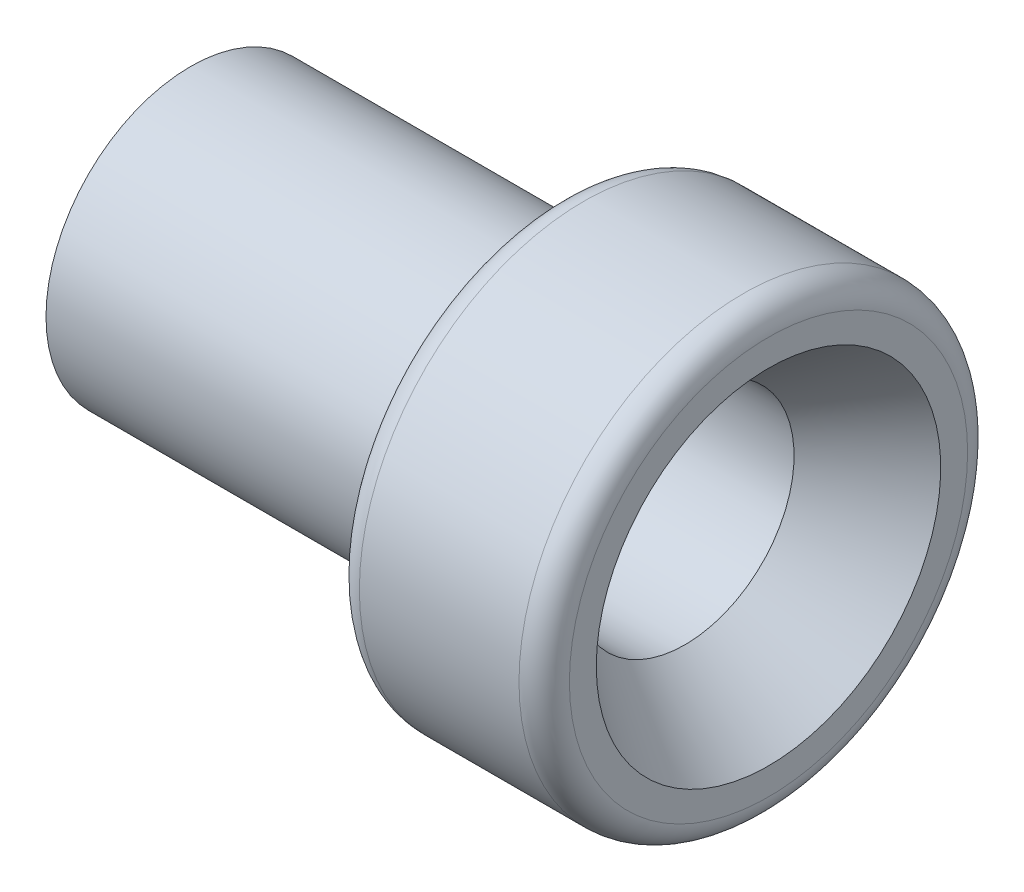
ISO-10303-21;
HEADER;
FILE_DESCRIPTION(('STEP AP214'),'2;1');
FILE_NAME('part.step','',(''),(''),'','','');
FILE_SCHEMA(('AUTOMOTIVE_DESIGN { 1 0 10303 214 1 1 1 1 }'));
ENDSEC;
DATA;
#1=APPLICATION_CONTEXT('core data for automotive mechanical design processes');
#2=APPLICATION_PROTOCOL_DEFINITION('international standard','automotive_design',2000,#1);
#3=PRODUCT_CONTEXT('',#1,'mechanical');
#4=PRODUCT('Part','Part','',(#3));
#5=PRODUCT_RELATED_PRODUCT_CATEGORY('part','',(#4));
#6=PRODUCT_DEFINITION_FORMATION('','',#4);
#7=PRODUCT_DEFINITION_CONTEXT('part definition',#1,'design');
#8=PRODUCT_DEFINITION('design','',#6,#7);
#9=PRODUCT_DEFINITION_SHAPE('','',#8);
#10=(LENGTH_UNIT() NAMED_UNIT(*) SI_UNIT(.MILLI.,.METRE.));
#11=(NAMED_UNIT(*) PLANE_ANGLE_UNIT() SI_UNIT($,.RADIAN.));
#12=(NAMED_UNIT(*) SI_UNIT($,.STERADIAN.) SOLID_ANGLE_UNIT());
#13=UNCERTAINTY_MEASURE_WITH_UNIT(LENGTH_MEASURE(1.E-05),#10,'distance_accuracy_value','');
#14=(GEOMETRIC_REPRESENTATION_CONTEXT(3) GLOBAL_UNCERTAINTY_ASSIGNED_CONTEXT((#13)) GLOBAL_UNIT_ASSIGNED_CONTEXT((#10,
#11,#12)) REPRESENTATION_CONTEXT('',''));
#15=CARTESIAN_POINT('',(0.,0.,0.));
#16=DIRECTION('',(0.,0.,1.));
#17=DIRECTION('',(1.,0.,0.));
#18=AXIS2_PLACEMENT_3D('',#15,#16,#17);
#19=CARTESIAN_POINT('',(-4.3688,1.651,0.));
#20=DIRECTION('',(1.,0.,0.));
#21=DIRECTION('',(0.,0.,-1.));
#22=AXIS2_PLACEMENT_3D('',#19,#20,#21);
#23=PLANE('',#22);
#24=CARTESIAN_POINT('',(-4.3688,0.,0.));
#25=DIRECTION('',(-1.,0.,0.));
#26=DIRECTION('',(0.,0.,1.));
#27=AXIS2_PLACEMENT_3D('',#24,#25,#26);
#28=CIRCLE('',#27,1.651);
#29=CARTESIAN_POINT('',(-4.3688,0.,1.651));
#30=VERTEX_POINT('',#29);
#31=EDGE_CURVE('E10',#30,#30,#28,.T.);
#32=ORIENTED_EDGE('',*,*,#31,.F.);
#33=EDGE_LOOP('',(#32));
#34=FACE_BOUND('',#33,.T.);
#35=CARTESIAN_POINT('',(-4.3688,0.,0.));
#36=DIRECTION('',(-1.,0.,0.));
#37=DIRECTION('',(0.,0.,1.));
#38=AXIS2_PLACEMENT_3D('',#35,#36,#37);
#39=CIRCLE('',#38,2.1844);
#40=CARTESIAN_POINT('',(-4.3688,0.,2.1844));
#41=VERTEX_POINT('',#40);
#42=EDGE_CURVE('E61',#41,#41,#39,.T.);
#43=ORIENTED_EDGE('',*,*,#42,.T.);
#44=EDGE_LOOP('',(#43));
#45=FACE_BOUND('',#44,.T.);
#46=ADVANCED_FACE('F30',(#34,#45),#23,.F.);
#47=CARTESIAN_POINT('',(-4.3688,0.,0.));
#48=DIRECTION('',(-1.,0.,0.));
#49=DIRECTION('',(0.,0.,1.));
#50=AXIS2_PLACEMENT_3D('',#47,#48,#49);
#51=CYLINDRICAL_SURFACE('',#50,1.651);
#52=CARTESIAN_POINT('',(3.10478980740656,0.,0.));
#53=DIRECTION('',(-1.,0.,0.));
#54=DIRECTION('',(0.,0.,1.));
#55=AXIS2_PLACEMENT_3D('',#52,#53,#54);
#56=CIRCLE('',#55,1.651);
#57=CARTESIAN_POINT('',(3.10478980740656,0.,1.651));
#58=VERTEX_POINT('',#57);
#59=EDGE_CURVE('E36',#58,#58,#56,.T.);
#60=ORIENTED_EDGE('',*,*,#59,.F.);
#61=EDGE_LOOP('',(#60));
#62=FACE_BOUND('',#61,.T.);
#63=ORIENTED_EDGE('',*,*,#31,.T.);
#64=EDGE_LOOP('',(#63));
#65=FACE_BOUND('',#64,.T.);
#66=ADVANCED_FACE('F104',(#62,#65),#51,.F.);
#67=CARTESIAN_POINT('',(3.10478980740656,0.,0.));
#68=DIRECTION('',(1.,0.,0.));
#69=DIRECTION('',(0.,0.,-1.));
#70=AXIS2_PLACEMENT_3D('',#67,#68,#69);
#71=CONICAL_SURFACE('',#70,1.651,0.645771823237904);
#72=CARTESIAN_POINT('',(4.3688,0.,0.));
#73=DIRECTION('',(-1.,0.,0.));
#74=DIRECTION('',(0.,0.,1.));
#75=AXIS2_PLACEMENT_3D('',#72,#73,#74);
#76=CIRCLE('',#75,2.6035);
#77=CARTESIAN_POINT('',(4.3688,0.,2.6035));
#78=VERTEX_POINT('',#77);
#79=EDGE_CURVE('E40',#78,#78,#76,.T.);
#80=ORIENTED_EDGE('',*,*,#79,.F.);
#81=EDGE_LOOP('',(#80));
#82=FACE_BOUND('',#81,.T.);
#83=ORIENTED_EDGE('',*,*,#59,.T.);
#84=EDGE_LOOP('',(#83));
#85=FACE_BOUND('',#84,.T.);
#86=ADVANCED_FACE('F99',(#82,#85),#71,.F.);
#87=CARTESIAN_POINT('',(4.3688,2.6035,0.));
#88=DIRECTION('',(-1.,0.,0.));
#89=DIRECTION('',(0.,0.,1.));
#90=AXIS2_PLACEMENT_3D('',#87,#88,#89);
#91=PLANE('',#90);
#92=CARTESIAN_POINT('',(4.3688,0.,0.));
#93=DIRECTION('',(-1.,0.,0.));
#94=DIRECTION('',(0.,0.,1.));
#95=AXIS2_PLACEMENT_3D('',#92,#93,#94);
#96=CIRCLE('',#95,3.0099);
#97=CARTESIAN_POINT('',(4.3688,0.,3.0099));
#98=VERTEX_POINT('',#97);
#99=EDGE_CURVE('E44',#98,#98,#96,.T.);
#100=ORIENTED_EDGE('',*,*,#99,.F.);
#101=EDGE_LOOP('',(#100));
#102=FACE_BOUND('',#101,.T.);
#103=ORIENTED_EDGE('',*,*,#79,.T.);
#104=EDGE_LOOP('',(#103));
#105=FACE_BOUND('',#104,.T.);
#106=ADVANCED_FACE('F93',(#102,#105),#91,.F.);
#107=CARTESIAN_POINT('',(3.9878,0.,0.));
#108=DIRECTION('',(-1.,0.,0.));
#109=DIRECTION('',(0.,0.,1.));
#110=AXIS2_PLACEMENT_3D('',#107,#108,#109);
#111=TOROIDAL_SURFACE('',#110,3.0099,0.381000000000001);
#112=CARTESIAN_POINT('',(3.9878,0.,0.));
#113=DIRECTION('',(-1.,0.,0.));
#114=DIRECTION('',(0.,0.,1.));
#115=AXIS2_PLACEMENT_3D('',#112,#113,#114);
#116=CIRCLE('',#115,3.3909);
#117=CARTESIAN_POINT('',(3.9878,0.,3.3909));
#118=VERTEX_POINT('',#117);
#119=EDGE_CURVE('E49',#118,#118,#116,.T.);
#120=ORIENTED_EDGE('',*,*,#119,.F.);
#121=EDGE_LOOP('',(#120));
#122=FACE_BOUND('',#121,.T.);
#123=ORIENTED_EDGE('',*,*,#99,.T.);
#124=EDGE_LOOP('',(#123));
#125=FACE_BOUND('',#124,.T.);
#126=ADVANCED_FACE('F87',(#122,#125),#111,.T.);
#127=CARTESIAN_POINT('',(-4.3688,0.,0.));
#128=DIRECTION('',(-1.,0.,0.));
#129=DIRECTION('',(0.,0.,1.));
#130=AXIS2_PLACEMENT_3D('',#127,#128,#129);
#131=CYLINDRICAL_SURFACE('',#130,3.3909);
#132=CARTESIAN_POINT('',(1.5748,0.,0.));
#133=DIRECTION('',(-1.,0.,0.));
#134=DIRECTION('',(0.,0.,1.));
#135=AXIS2_PLACEMENT_3D('',#132,#133,#134);
#136=CIRCLE('',#135,3.3909);
#137=CARTESIAN_POINT('',(1.5748,0.,3.3909));
#138=VERTEX_POINT('',#137);
#139=EDGE_CURVE('E52',#138,#138,#136,.T.);
#140=ORIENTED_EDGE('',*,*,#139,.F.);
#141=EDGE_LOOP('',(#140));
#142=FACE_BOUND('',#141,.T.);
#143=ORIENTED_EDGE('',*,*,#119,.T.);
#144=EDGE_LOOP('',(#143));
#145=FACE_BOUND('',#144,.T.);
#146=ADVANCED_FACE('F81',(#142,#145),#131,.T.);
#147=CARTESIAN_POINT('',(1.5748,0.,0.));
#148=DIRECTION('',(-1.,0.,0.));
#149=DIRECTION('',(0.,0.,1.));
#150=AXIS2_PLACEMENT_3D('',#147,#148,#149);
#151=TOROIDAL_SURFACE('',#150,3.0099,0.381);
#152=CARTESIAN_POINT('',(1.1938,0.,0.));
#153=DIRECTION('',(-1.,0.,0.));
#154=DIRECTION('',(0.,0.,1.));
#155=AXIS2_PLACEMENT_3D('',#152,#153,#154);
#156=CIRCLE('',#155,3.0099);
#157=CARTESIAN_POINT('',(1.1938,0.,3.0099));
#158=VERTEX_POINT('',#157);
#159=EDGE_CURVE('E55',#158,#158,#156,.T.);
#160=ORIENTED_EDGE('',*,*,#159,.F.);
#161=EDGE_LOOP('',(#160));
#162=FACE_BOUND('',#161,.T.);
#163=ORIENTED_EDGE('',*,*,#139,.T.);
#164=EDGE_LOOP('',(#163));
#165=FACE_BOUND('',#164,.T.);
#166=ADVANCED_FACE('F75',(#162,#165),#151,.T.);
#167=CARTESIAN_POINT('',(1.1938,3.0099,0.));
#168=DIRECTION('',(1.,0.,0.));
#169=DIRECTION('',(0.,0.,-1.));
#170=AXIS2_PLACEMENT_3D('',#167,#168,#169);
#171=PLANE('',#170);
#172=CARTESIAN_POINT('',(1.1938,0.,0.));
#173=DIRECTION('',(-1.,0.,0.));
#174=DIRECTION('',(0.,0.,1.));
#175=AXIS2_PLACEMENT_3D('',#172,#173,#174);
#176=CIRCLE('',#175,2.1844);
#177=CARTESIAN_POINT('',(1.1938,0.,2.1844));
#178=VERTEX_POINT('',#177);
#179=EDGE_CURVE('E58',#178,#178,#176,.T.);
#180=ORIENTED_EDGE('',*,*,#179,.F.);
#181=EDGE_LOOP('',(#180));
#182=FACE_BOUND('',#181,.T.);
#183=ORIENTED_EDGE('',*,*,#159,.T.);
#184=EDGE_LOOP('',(#183));
#185=FACE_BOUND('',#184,.T.);
#186=ADVANCED_FACE('F69',(#182,#185),#171,.F.);
#187=CARTESIAN_POINT('',(-4.3688,0.,0.));
#188=DIRECTION('',(-1.,0.,0.));
#189=DIRECTION('',(0.,0.,1.));
#190=AXIS2_PLACEMENT_3D('',#187,#188,#189);
#191=CYLINDRICAL_SURFACE('',#190,2.1844);
#192=ORIENTED_EDGE('',*,*,#42,.F.);
#193=EDGE_LOOP('',(#192));
#194=FACE_BOUND('',#193,.T.);
#195=ORIENTED_EDGE('',*,*,#179,.T.);
#196=EDGE_LOOP('',(#195));
#197=FACE_BOUND('',#196,.T.);
#198=ADVANCED_FACE('F66',(#194,#197),#191,.T.);
#199=CLOSED_SHELL('',(#46,#66,#86,#106,#126,#146,#166,#186,#198));
#200=MANIFOLD_SOLID_BREP('B2',#199);
#201=ADVANCED_BREP_SHAPE_REPRESENTATION('',(#18,#200),#14);
#202=SHAPE_DEFINITION_REPRESENTATION(#9,#201);
ENDSEC;
END-ISO-10303-21;
